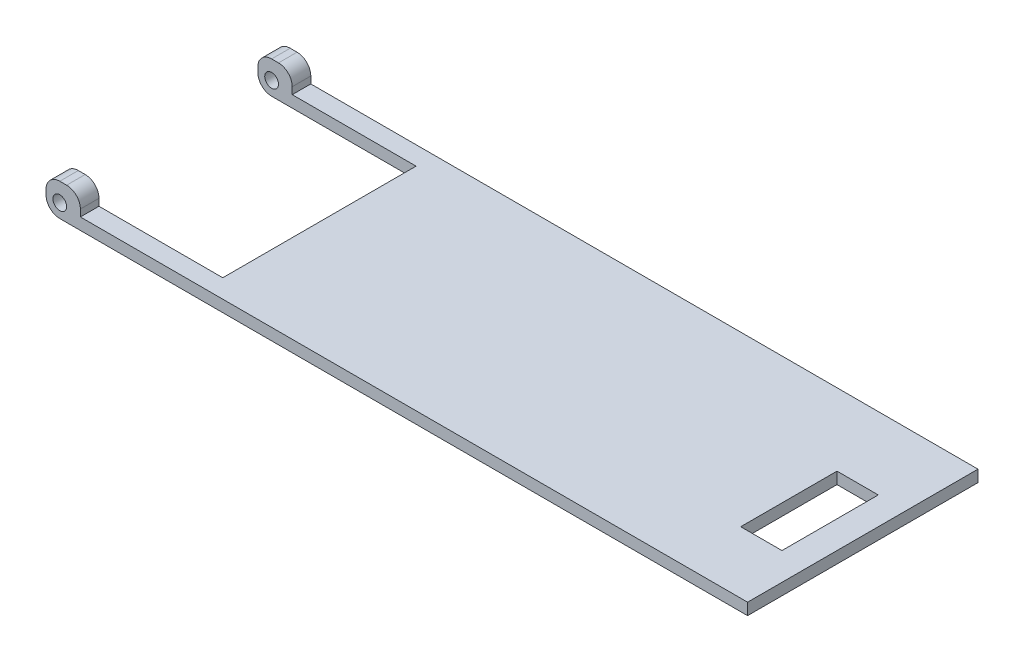
ISO-10303-21;
HEADER;
FILE_DESCRIPTION(('STEP AP214'),'2;1');
FILE_NAME('part.step','',(''),(''),'','','');
FILE_SCHEMA(('AUTOMOTIVE_DESIGN { 1 0 10303 214 1 1 1 1 }'));
ENDSEC;
DATA;
#1=APPLICATION_CONTEXT('core data for automotive mechanical design processes');
#2=APPLICATION_PROTOCOL_DEFINITION('international standard','automotive_design',2000,#1);
#3=PRODUCT_CONTEXT('',#1,'mechanical');
#4=PRODUCT('Part','Part','',(#3));
#5=PRODUCT_RELATED_PRODUCT_CATEGORY('part','',(#4));
#6=PRODUCT_DEFINITION_FORMATION('','',#4);
#7=PRODUCT_DEFINITION_CONTEXT('part definition',#1,'design');
#8=PRODUCT_DEFINITION('design','',#6,#7);
#9=PRODUCT_DEFINITION_SHAPE('','',#8);
#10=(LENGTH_UNIT() NAMED_UNIT(*) SI_UNIT(.MILLI.,.METRE.));
#11=(NAMED_UNIT(*) PLANE_ANGLE_UNIT() SI_UNIT($,.RADIAN.));
#12=(NAMED_UNIT(*) SI_UNIT($,.STERADIAN.) SOLID_ANGLE_UNIT());
#13=UNCERTAINTY_MEASURE_WITH_UNIT(LENGTH_MEASURE(1.E-05),#10,'distance_accuracy_value','');
#14=(GEOMETRIC_REPRESENTATION_CONTEXT(3) GLOBAL_UNCERTAINTY_ASSIGNED_CONTEXT((#13)) GLOBAL_UNIT_ASSIGNED_CONTEXT((#10,
#11,#12)) REPRESENTATION_CONTEXT('',''));
#15=CARTESIAN_POINT('',(0.,0.,0.));
#16=DIRECTION('',(0.,0.,1.));
#17=DIRECTION('',(1.,0.,0.));
#18=AXIS2_PLACEMENT_3D('',#15,#16,#17);
#19=CARTESIAN_POINT('',(0.,1.7,0.));
#20=DIRECTION('',(0.,-1.,0.));
#21=DIRECTION('',(0.,0.,-1.));
#22=AXIS2_PLACEMENT_3D('',#19,#20,#21);
#23=PLANE('',#22);
#24=DIRECTION('',(-1.,0.,0.));
#25=VECTOR('',#24,1.);
#26=CARTESIAN_POINT('',(41.,1.7,-6.25));
#27=LINE('',#26,#25);
#28=CARTESIAN_POINT('',(47.,1.7,-6.25));
#29=VERTEX_POINT('',#28);
#30=CARTESIAN_POINT('',(41.,1.7,-6.25));
#31=VERTEX_POINT('',#30);
#32=EDGE_CURVE('E228',#29,#31,#27,.T.);
#33=ORIENTED_EDGE('',*,*,#32,.F.);
#34=DIRECTION('',(0.,0.,-1.));
#35=VECTOR('',#34,1.);
#36=CARTESIAN_POINT('',(47.,1.7,7.75));
#37=LINE('',#36,#35);
#38=CARTESIAN_POINT('',(47.,1.7,7.75));
#39=VERTEX_POINT('',#38);
#40=EDGE_CURVE('E61',#39,#29,#37,.T.);
#41=ORIENTED_EDGE('',*,*,#40,.F.);
#42=DIRECTION('',(1.,0.,0.));
#43=VECTOR('',#42,1.);
#44=CARTESIAN_POINT('',(41.,1.7,7.75));
#45=LINE('',#44,#43);
#46=CARTESIAN_POINT('',(41.,1.7,7.75));
#47=VERTEX_POINT('',#46);
#48=EDGE_CURVE('E215',#47,#39,#45,.T.);
#49=ORIENTED_EDGE('',*,*,#48,.F.);
#50=DIRECTION('',(0.,0.,1.));
#51=VECTOR('',#50,1.);
#52=CARTESIAN_POINT('',(41.,1.7,7.75));
#53=LINE('',#52,#51);
#54=EDGE_CURVE('E219',#31,#47,#53,.T.);
#55=ORIENTED_EDGE('',*,*,#54,.F.);
#56=EDGE_LOOP('',(#33,#41,#49,#55));
#57=FACE_BOUND('',#56,.T.);
#58=DIRECTION('',(-1.,0.,0.));
#59=VECTOR('',#58,1.);
#60=CARTESIAN_POINT('',(-51.,1.7,-16.75));
#61=LINE('',#60,#59);
#62=CARTESIAN_POINT('',(51.,1.7,-16.75));
#63=VERTEX_POINT('',#62);
#64=CARTESIAN_POINT('',(-46.,1.7,-16.75));
#65=VERTEX_POINT('',#64);
#66=EDGE_CURVE('E336',#63,#65,#61,.T.);
#67=ORIENTED_EDGE('',*,*,#66,.T.);
#68=DIRECTION('',(0.,0.,1.));
#69=VECTOR('',#68,1.);
#70=CARTESIAN_POINT('',(-46.,1.7,-14.05));
#71=LINE('',#70,#69);
#72=CARTESIAN_POINT('',(-46.,1.7,-14.05));
#73=VERTEX_POINT('',#72);
#74=EDGE_CURVE('E247',#65,#73,#71,.T.);
#75=ORIENTED_EDGE('',*,*,#74,.T.);
#76=DIRECTION('',(-1.,0.,0.));
#77=VECTOR('',#76,1.);
#78=CARTESIAN_POINT('',(-51.,1.7,-14.05));
#79=LINE('',#78,#77);
#80=CARTESIAN_POINT('',(-28.,1.7,-14.05));
#81=VERTEX_POINT('',#80);
#82=EDGE_CURVE('E299',#81,#73,#79,.T.);
#83=ORIENTED_EDGE('',*,*,#82,.F.);
#84=DIRECTION('',(0.,0.,-1.));
#85=VECTOR('',#84,1.);
#86=CARTESIAN_POINT('',(-28.,1.7,14.05));
#87=LINE('',#86,#85);
#88=CARTESIAN_POINT('',(-28.,1.7,14.05));
#89=VERTEX_POINT('',#88);
#90=EDGE_CURVE('E310',#89,#81,#87,.T.);
#91=ORIENTED_EDGE('',*,*,#90,.F.);
#92=DIRECTION('',(1.,0.,0.));
#93=VECTOR('',#92,1.);
#94=CARTESIAN_POINT('',(-51.,1.7,14.05));
#95=LINE('',#94,#93);
#96=CARTESIAN_POINT('',(-46.,1.7,14.05));
#97=VERTEX_POINT('',#96);
#98=EDGE_CURVE('E294',#97,#89,#95,.T.);
#99=ORIENTED_EDGE('',*,*,#98,.F.);
#100=DIRECTION('',(0.,0.,-1.));
#101=VECTOR('',#100,1.);
#102=CARTESIAN_POINT('',(-46.,1.7,14.05));
#103=LINE('',#102,#101);
#104=CARTESIAN_POINT('',(-46.,1.7,16.75));
#105=VERTEX_POINT('',#104);
#106=EDGE_CURVE('E273',#105,#97,#103,.T.);
#107=ORIENTED_EDGE('',*,*,#106,.F.);
#108=DIRECTION('',(1.,0.,0.));
#109=VECTOR('',#108,1.);
#110=CARTESIAN_POINT('',(-51.,1.7,16.75));
#111=LINE('',#110,#109);
#112=CARTESIAN_POINT('',(51.,1.7,16.75));
#113=VERTEX_POINT('',#112);
#114=EDGE_CURVE('E341',#105,#113,#111,.T.);
#115=ORIENTED_EDGE('',*,*,#114,.T.);
#116=DIRECTION('',(0.,0.,-1.));
#117=VECTOR('',#116,1.);
#118=CARTESIAN_POINT('',(51.,1.7,16.75));
#119=LINE('',#118,#117);
#120=EDGE_CURVE('E332',#113,#63,#119,.T.);
#121=ORIENTED_EDGE('',*,*,#120,.T.);
#122=EDGE_LOOP('',(#67,#75,#83,#91,#99,#107,#115,#121));
#123=FACE_BOUND('',#122,.T.);
#124=ADVANCED_FACE('F45',(#57,#123),#23,.F.);
#125=CARTESIAN_POINT('',(-51.,1.7,16.75));
#126=DIRECTION('',(1.,0.,0.));
#127=DIRECTION('',(0.,0.,-1.));
#128=AXIS2_PLACEMENT_3D('',#125,#126,#127);
#129=PLANE('',#128);
#130=DIRECTION('',(0.,-1.,0.));
#131=VECTOR('',#130,1.);
#132=CARTESIAN_POINT('',(-51.,1.7,-16.75));
#133=LINE('',#132,#131);
#134=CARTESIAN_POINT('',(-51.,2.7,-16.75));
#135=VERTEX_POINT('',#134);
#136=CARTESIAN_POINT('',(-51.,2.,-16.75));
#137=VERTEX_POINT('',#136);
#138=EDGE_CURVE('E361',#135,#137,#133,.T.);
#139=ORIENTED_EDGE('',*,*,#138,.T.);
#140=DIRECTION('',(0.,0.,1.));
#141=VECTOR('',#140,1.);
#142=CARTESIAN_POINT('',(-51.,2.,-14.05));
#143=LINE('',#142,#141);
#144=CARTESIAN_POINT('',(-51.,2.,-14.05));
#145=VERTEX_POINT('',#144);
#146=EDGE_CURVE('E412',#137,#145,#143,.T.);
#147=ORIENTED_EDGE('',*,*,#146,.T.);
#148=DIRECTION('',(0.,1.,0.));
#149=VECTOR('',#148,1.);
#150=CARTESIAN_POINT('',(-51.,0.,-14.05));
#151=LINE('',#150,#149);
#152=CARTESIAN_POINT('',(-51.,2.7,-14.05));
#153=VERTEX_POINT('',#152);
#154=EDGE_CURVE('E317',#145,#153,#151,.T.);
#155=ORIENTED_EDGE('',*,*,#154,.T.);
#156=DIRECTION('',(0.,0.,-1.));
#157=VECTOR('',#156,1.);
#158=CARTESIAN_POINT('',(-51.,2.7,-16.75));
#159=LINE('',#158,#157);
#160=EDGE_CURVE('E408',#153,#135,#159,.T.);
#161=ORIENTED_EDGE('',*,*,#160,.T.);
#162=EDGE_LOOP('',(#139,#147,#155,#161));
#163=FACE_BOUND('',#162,.T.);
#164=ADVANCED_FACE('F456',(#163),#129,.F.);
#165=CARTESIAN_POINT('',(51.,1.7,16.75));
#166=DIRECTION('',(-1.,0.,0.));
#167=DIRECTION('',(0.,0.,1.));
#168=AXIS2_PLACEMENT_3D('',#165,#166,#167);
#169=PLANE('',#168);
#170=DIRECTION('',(0.,0.,-1.));
#171=VECTOR('',#170,1.);
#172=CARTESIAN_POINT('',(51.,0.,16.75));
#173=LINE('',#172,#171);
#174=CARTESIAN_POINT('',(51.,0.,16.75));
#175=VERTEX_POINT('',#174);
#176=CARTESIAN_POINT('',(51.,0.,-16.75));
#177=VERTEX_POINT('',#176);
#178=EDGE_CURVE('E321',#175,#177,#173,.T.);
#179=ORIENTED_EDGE('',*,*,#178,.T.);
#180=DIRECTION('',(0.,-1.,0.));
#181=VECTOR('',#180,1.);
#182=CARTESIAN_POINT('',(51.,1.7,-16.75));
#183=LINE('',#182,#181);
#184=EDGE_CURVE('E365',#63,#177,#183,.T.);
#185=ORIENTED_EDGE('',*,*,#184,.F.);
#186=ORIENTED_EDGE('',*,*,#120,.F.);
#187=DIRECTION('',(0.,-1.,0.));
#188=VECTOR('',#187,1.);
#189=CARTESIAN_POINT('',(51.,1.7,16.75));
#190=LINE('',#189,#188);
#191=EDGE_CURVE('E344',#113,#175,#190,.T.);
#192=ORIENTED_EDGE('',*,*,#191,.T.);
#193=EDGE_LOOP('',(#179,#185,#186,#192));
#194=FACE_BOUND('',#193,.T.);
#195=ADVANCED_FACE('F512',(#194),#169,.F.);
#196=CARTESIAN_POINT('',(-51.,1.7,-16.75));
#197=DIRECTION('',(0.,0.,1.));
#198=DIRECTION('',(1.,0.,0.));
#199=AXIS2_PLACEMENT_3D('',#196,#197,#198);
#200=PLANE('',#199);
#201=CARTESIAN_POINT('',(-49.,2.,-16.75));
#202=DIRECTION('',(0.,0.,1.));
#203=DIRECTION('',(1.,0.,0.));
#204=AXIS2_PLACEMENT_3D('',#201,#202,#203);
#205=CIRCLE('',#204,0.999999999999998);
#206=CARTESIAN_POINT('',(-50.,2.,-16.75));
#207=VERTEX_POINT('',#206);
#208=EDGE_CURVE('E237',#207,#207,#205,.T.);
#209=ORIENTED_EDGE('',*,*,#208,.T.);
#210=EDGE_LOOP('',(#209));
#211=FACE_BOUND('',#210,.T.);
#212=DIRECTION('',(-1.,0.,0.));
#213=VECTOR('',#212,1.);
#214=CARTESIAN_POINT('',(-51.,0.,-16.75));
#215=LINE('',#214,#213);
#216=CARTESIAN_POINT('',(-49.,0.,-16.75));
#217=VERTEX_POINT('',#216);
#218=EDGE_CURVE('E348',#177,#217,#215,.T.);
#219=ORIENTED_EDGE('',*,*,#218,.T.);
#220=CARTESIAN_POINT('',(-49.,2.,-16.75));
#221=DIRECTION('',(0.,0.,1.));
#222=DIRECTION('',(1.,0.,0.));
#223=AXIS2_PLACEMENT_3D('',#220,#221,#222);
#224=CIRCLE('',#223,2.);
#225=EDGE_CURVE('E434',#217,#137,#224,.F.);
#226=ORIENTED_EDGE('',*,*,#225,.T.);
#227=ORIENTED_EDGE('',*,*,#138,.F.);
#228=CARTESIAN_POINT('',(-49.,2.7,-16.75));
#229=DIRECTION('',(0.,0.,1.));
#230=DIRECTION('',(1.,0.,0.));
#231=AXIS2_PLACEMENT_3D('',#228,#229,#230);
#232=CIRCLE('',#231,2.);
#233=CARTESIAN_POINT('',(-49.,4.7,-16.75));
#234=VERTEX_POINT('',#233);
#235=EDGE_CURVE('E428',#135,#234,#232,.F.);
#236=ORIENTED_EDGE('',*,*,#235,.T.);
#237=DIRECTION('',(1.,0.,0.));
#238=VECTOR('',#237,1.);
#239=CARTESIAN_POINT('',(-51.,4.7,-16.75));
#240=LINE('',#239,#238);
#241=CARTESIAN_POINT('',(-48.,4.7,-16.75));
#242=VERTEX_POINT('',#241);
#243=EDGE_CURVE('E255',#234,#242,#240,.T.);
#244=ORIENTED_EDGE('',*,*,#243,.T.);
#245=CARTESIAN_POINT('',(-48.,2.7,-16.75));
#246=DIRECTION('',(0.,0.,1.));
#247=DIRECTION('',(1.,0.,0.));
#248=AXIS2_PLACEMENT_3D('',#245,#246,#247);
#249=CIRCLE('',#248,2.);
#250=CARTESIAN_POINT('',(-46.,2.7,-16.75));
#251=VERTEX_POINT('',#250);
#252=EDGE_CURVE('E431',#242,#251,#249,.F.);
#253=ORIENTED_EDGE('',*,*,#252,.T.);
#254=DIRECTION('',(0.,-1.,0.));
#255=VECTOR('',#254,1.);
#256=CARTESIAN_POINT('',(-46.,4.7,-16.75));
#257=LINE('',#256,#255);
#258=EDGE_CURVE('E259',#251,#65,#257,.T.);
#259=ORIENTED_EDGE('',*,*,#258,.T.);
#260=ORIENTED_EDGE('',*,*,#66,.F.);
#261=ORIENTED_EDGE('',*,*,#184,.T.);
#262=EDGE_LOOP('',(#219,#226,#227,#236,#244,#253,#259,#260,#261));
#263=FACE_BOUND('',#262,.T.);
#264=ADVANCED_FACE('F459',(#211,#263),#200,.F.);
#265=DIRECTION('',(0.,1.,0.));
#266=VECTOR('',#265,1.);
#267=CARTESIAN_POINT('',(-51.,0.,14.05));
#268=LINE('',#267,#266);
#269=CARTESIAN_POINT('',(-51.,2.,14.05));
#270=VERTEX_POINT('',#269);
#271=CARTESIAN_POINT('',(-51.,2.7,14.05));
#272=VERTEX_POINT('',#271);
#273=EDGE_CURVE('E307',#270,#272,#268,.T.);
#274=ORIENTED_EDGE('',*,*,#273,.F.);
#275=DIRECTION('',(0.,0.,1.));
#276=VECTOR('',#275,1.);
#277=CARTESIAN_POINT('',(-51.,2.,16.75));
#278=LINE('',#277,#276);
#279=CARTESIAN_POINT('',(-51.,2.,16.75));
#280=VERTEX_POINT('',#279);
#281=EDGE_CURVE('E372',#270,#280,#278,.T.);
#282=ORIENTED_EDGE('',*,*,#281,.T.);
#283=DIRECTION('',(0.,-1.,0.));
#284=VECTOR('',#283,1.);
#285=CARTESIAN_POINT('',(-51.,1.7,16.75));
#286=LINE('',#285,#284);
#287=CARTESIAN_POINT('',(-51.,2.7,16.75));
#288=VERTEX_POINT('',#287);
#289=EDGE_CURVE('E357',#288,#280,#286,.T.);
#290=ORIENTED_EDGE('',*,*,#289,.F.);
#291=DIRECTION('',(0.,0.,1.));
#292=VECTOR('',#291,1.);
#293=CARTESIAN_POINT('',(-51.,2.7,14.05));
#294=LINE('',#293,#292);
#295=EDGE_CURVE('E369',#288,#272,#294,.F.);
#296=ORIENTED_EDGE('',*,*,#295,.T.);
#297=EDGE_LOOP('',(#274,#282,#290,#296));
#298=FACE_BOUND('',#297,.T.);
#299=ADVANCED_FACE('F503',(#298),#129,.F.);
#300=CARTESIAN_POINT('',(-51.,1.7,16.75));
#301=DIRECTION('',(0.,0.,-1.));
#302=DIRECTION('',(-1.,0.,0.));
#303=AXIS2_PLACEMENT_3D('',#300,#301,#302);
#304=PLANE('',#303);
#305=CARTESIAN_POINT('',(-49.,2.,16.75));
#306=DIRECTION('',(0.,0.,1.));
#307=DIRECTION('',(1.,0.,0.));
#308=AXIS2_PLACEMENT_3D('',#305,#306,#307);
#309=CIRCLE('',#308,0.999999999999998);
#310=CARTESIAN_POINT('',(-48.,2.,16.75));
#311=VERTEX_POINT('',#310);
#312=EDGE_CURVE('E268',#311,#311,#309,.T.);
#313=ORIENTED_EDGE('',*,*,#312,.F.);
#314=EDGE_LOOP('',(#313));
#315=FACE_BOUND('',#314,.T.);
#316=ORIENTED_EDGE('',*,*,#289,.T.);
#317=CARTESIAN_POINT('',(-49.,2.,16.75));
#318=DIRECTION('',(0.,0.,-1.));
#319=DIRECTION('',(-1.,0.,0.));
#320=AXIS2_PLACEMENT_3D('',#317,#318,#319);
#321=CIRCLE('',#320,2.);
#322=CARTESIAN_POINT('',(-49.,0.,16.75));
#323=VERTEX_POINT('',#322);
#324=EDGE_CURVE('E382',#280,#323,#321,.F.);
#325=ORIENTED_EDGE('',*,*,#324,.T.);
#326=DIRECTION('',(1.,0.,0.));
#327=VECTOR('',#326,1.);
#328=CARTESIAN_POINT('',(-51.,0.,16.75));
#329=LINE('',#328,#327);
#330=EDGE_CURVE('E337',#323,#175,#329,.T.);
#331=ORIENTED_EDGE('',*,*,#330,.T.);
#332=ORIENTED_EDGE('',*,*,#191,.F.);
#333=ORIENTED_EDGE('',*,*,#114,.F.);
#334=DIRECTION('',(0.,-1.,0.));
#335=VECTOR('',#334,1.);
#336=CARTESIAN_POINT('',(-46.,4.7,16.75));
#337=LINE('',#336,#335);
#338=CARTESIAN_POINT('',(-46.,2.7,16.75));
#339=VERTEX_POINT('',#338);
#340=EDGE_CURVE('E291',#339,#105,#337,.T.);
#341=ORIENTED_EDGE('',*,*,#340,.F.);
#342=CARTESIAN_POINT('',(-48.,2.7,16.75));
#343=DIRECTION('',(0.,0.,-1.));
#344=DIRECTION('',(-1.,0.,0.));
#345=AXIS2_PLACEMENT_3D('',#342,#343,#344);
#346=CIRCLE('',#345,2.);
#347=CARTESIAN_POINT('',(-48.,4.7,16.75));
#348=VERTEX_POINT('',#347);
#349=EDGE_CURVE('E379',#339,#348,#346,.F.);
#350=ORIENTED_EDGE('',*,*,#349,.T.);
#351=DIRECTION('',(1.,0.,0.));
#352=VECTOR('',#351,1.);
#353=CARTESIAN_POINT('',(-51.,4.7,16.75));
#354=LINE('',#353,#352);
#355=CARTESIAN_POINT('',(-49.,4.7,16.75));
#356=VERTEX_POINT('',#355);
#357=EDGE_CURVE('E277',#356,#348,#354,.T.);
#358=ORIENTED_EDGE('',*,*,#357,.F.);
#359=CARTESIAN_POINT('',(-49.,2.7,16.75));
#360=DIRECTION('',(0.,0.,-1.));
#361=DIRECTION('',(-1.,0.,0.));
#362=AXIS2_PLACEMENT_3D('',#359,#360,#361);
#363=CIRCLE('',#362,2.);
#364=EDGE_CURVE('E376',#356,#288,#363,.F.);
#365=ORIENTED_EDGE('',*,*,#364,.T.);
#366=EDGE_LOOP('',(#316,#325,#331,#332,#333,#341,#350,#358,#365));
#367=FACE_BOUND('',#366,.T.);
#368=ADVANCED_FACE('F486',(#315,#367),#304,.F.);
#369=CARTESIAN_POINT('',(0.,0.,0.));
#370=DIRECTION('',(0.,-1.,0.));
#371=DIRECTION('',(0.,0.,-1.));
#372=AXIS2_PLACEMENT_3D('',#369,#370,#371);
#373=PLANE('',#372);
#374=DIRECTION('',(0.,0.,-1.));
#375=VECTOR('',#374,1.);
#376=CARTESIAN_POINT('',(47.,0.,7.75));
#377=LINE('',#376,#375);
#378=CARTESIAN_POINT('',(47.,0.,7.75));
#379=VERTEX_POINT('',#378);
#380=CARTESIAN_POINT('',(47.,0.,-6.25));
#381=VERTEX_POINT('',#380);
#382=EDGE_CURVE('E196',#379,#381,#377,.T.);
#383=ORIENTED_EDGE('',*,*,#382,.T.);
#384=DIRECTION('',(-1.,0.,0.));
#385=VECTOR('',#384,1.);
#386=CARTESIAN_POINT('',(41.,0.,-6.25));
#387=LINE('',#386,#385);
#388=CARTESIAN_POINT('',(41.,0.,-6.25));
#389=VERTEX_POINT('',#388);
#390=EDGE_CURVE('E206',#381,#389,#387,.T.);
#391=ORIENTED_EDGE('',*,*,#390,.T.);
#392=DIRECTION('',(0.,0.,1.));
#393=VECTOR('',#392,1.);
#394=CARTESIAN_POINT('',(41.,0.,7.75));
#395=LINE('',#394,#393);
#396=CARTESIAN_POINT('',(41.,0.,7.75));
#397=VERTEX_POINT('',#396);
#398=EDGE_CURVE('E69',#389,#397,#395,.T.);
#399=ORIENTED_EDGE('',*,*,#398,.T.);
#400=DIRECTION('',(1.,0.,0.));
#401=VECTOR('',#400,1.);
#402=CARTESIAN_POINT('',(41.,0.,7.75));
#403=LINE('',#402,#401);
#404=EDGE_CURVE('E203',#397,#379,#403,.T.);
#405=ORIENTED_EDGE('',*,*,#404,.T.);
#406=EDGE_LOOP('',(#383,#391,#399,#405));
#407=FACE_BOUND('',#406,.T.);
#408=DIRECTION('',(-1.,0.,0.));
#409=VECTOR('',#408,1.);
#410=CARTESIAN_POINT('',(-51.,0.,-14.05));
#411=LINE('',#410,#409);
#412=CARTESIAN_POINT('',(-28.,0.,-14.05));
#413=VERTEX_POINT('',#412);
#414=CARTESIAN_POINT('',(-49.,0.,-14.05));
#415=VERTEX_POINT('',#414);
#416=EDGE_CURVE('E303',#413,#415,#411,.T.);
#417=ORIENTED_EDGE('',*,*,#416,.T.);
#418=DIRECTION('',(0.,0.,1.));
#419=VECTOR('',#418,1.);
#420=CARTESIAN_POINT('',(-49.,0.,-16.75));
#421=LINE('',#420,#419);
#422=EDGE_CURVE('E425',#415,#217,#421,.F.);
#423=ORIENTED_EDGE('',*,*,#422,.T.);
#424=ORIENTED_EDGE('',*,*,#218,.F.);
#425=ORIENTED_EDGE('',*,*,#178,.F.);
#426=ORIENTED_EDGE('',*,*,#330,.F.);
#427=DIRECTION('',(0.,0.,1.));
#428=VECTOR('',#427,1.);
#429=CARTESIAN_POINT('',(-49.,0.,14.05));
#430=LINE('',#429,#428);
#431=CARTESIAN_POINT('',(-49.,0.,14.05));
#432=VERTEX_POINT('',#431);
#433=EDGE_CURVE('E385',#323,#432,#430,.F.);
#434=ORIENTED_EDGE('',*,*,#433,.T.);
#435=DIRECTION('',(1.,0.,0.));
#436=VECTOR('',#435,1.);
#437=CARTESIAN_POINT('',(-51.,0.,14.05));
#438=LINE('',#437,#436);
#439=CARTESIAN_POINT('',(-28.,0.,14.05));
#440=VERTEX_POINT('',#439);
#441=EDGE_CURVE('E295',#432,#440,#438,.T.);
#442=ORIENTED_EDGE('',*,*,#441,.T.);
#443=DIRECTION('',(0.,0.,-1.));
#444=VECTOR('',#443,1.);
#445=CARTESIAN_POINT('',(-28.,0.,14.05));
#446=LINE('',#445,#444);
#447=EDGE_CURVE('E298',#440,#413,#446,.T.);
#448=ORIENTED_EDGE('',*,*,#447,.T.);
#449=EDGE_LOOP('',(#417,#423,#424,#425,#426,#434,#442,#448));
#450=FACE_BOUND('',#449,.T.);
#451=ADVANCED_FACE('F211',(#407,#450),#373,.T.);
#452=CARTESIAN_POINT('',(-51.,0.,-14.05));
#453=DIRECTION('',(0.,0.,-1.));
#454=DIRECTION('',(-1.,0.,0.));
#455=AXIS2_PLACEMENT_3D('',#452,#453,#454);
#456=PLANE('',#455);
#457=CARTESIAN_POINT('',(-49.,2.,-14.05));
#458=DIRECTION('',(0.,0.,1.));
#459=DIRECTION('',(1.,0.,0.));
#460=AXIS2_PLACEMENT_3D('',#457,#458,#459);
#461=CIRCLE('',#460,0.999999999999998);
#462=CARTESIAN_POINT('',(-50.,2.,-14.05));
#463=VERTEX_POINT('',#462);
#464=EDGE_CURVE('E243',#463,#463,#461,.T.);
#465=ORIENTED_EDGE('',*,*,#464,.F.);
#466=EDGE_LOOP('',(#465));
#467=FACE_BOUND('',#466,.T.);
#468=ORIENTED_EDGE('',*,*,#154,.F.);
#469=CARTESIAN_POINT('',(-49.,2.,-14.05));
#470=DIRECTION('',(0.,0.,-1.));
#471=DIRECTION('',(-1.,0.,0.));
#472=AXIS2_PLACEMENT_3D('',#469,#470,#471);
#473=CIRCLE('',#472,2.);
#474=EDGE_CURVE('E422',#145,#415,#473,.F.);
#475=ORIENTED_EDGE('',*,*,#474,.T.);
#476=ORIENTED_EDGE('',*,*,#416,.F.);
#477=DIRECTION('',(0.,1.,0.));
#478=VECTOR('',#477,1.);
#479=CARTESIAN_POINT('',(-28.,0.,-14.05));
#480=LINE('',#479,#478);
#481=EDGE_CURVE('E322',#413,#81,#480,.T.);
#482=ORIENTED_EDGE('',*,*,#481,.T.);
#483=ORIENTED_EDGE('',*,*,#82,.T.);
#484=DIRECTION('',(0.,-1.,0.));
#485=VECTOR('',#484,1.);
#486=CARTESIAN_POINT('',(-46.,4.7,-14.05));
#487=LINE('',#486,#485);
#488=CARTESIAN_POINT('',(-46.,2.7,-14.05));
#489=VERTEX_POINT('',#488);
#490=EDGE_CURVE('E265',#489,#73,#487,.T.);
#491=ORIENTED_EDGE('',*,*,#490,.F.);
#492=CARTESIAN_POINT('',(-48.,2.7,-14.05));
#493=DIRECTION('',(0.,0.,-1.));
#494=DIRECTION('',(-1.,0.,0.));
#495=AXIS2_PLACEMENT_3D('',#492,#493,#494);
#496=CIRCLE('',#495,2.);
#497=CARTESIAN_POINT('',(-48.,4.7,-14.05));
#498=VERTEX_POINT('',#497);
#499=EDGE_CURVE('E419',#489,#498,#496,.F.);
#500=ORIENTED_EDGE('',*,*,#499,.T.);
#501=DIRECTION('',(-1.,0.,0.));
#502=VECTOR('',#501,1.);
#503=CARTESIAN_POINT('',(-51.,4.7,-14.05));
#504=LINE('',#503,#502);
#505=CARTESIAN_POINT('',(-49.,4.7,-14.05));
#506=VERTEX_POINT('',#505);
#507=EDGE_CURVE('E251',#498,#506,#504,.T.);
#508=ORIENTED_EDGE('',*,*,#507,.T.);
#509=CARTESIAN_POINT('',(-49.,2.7,-14.05));
#510=DIRECTION('',(0.,0.,-1.));
#511=DIRECTION('',(-1.,0.,0.));
#512=AXIS2_PLACEMENT_3D('',#509,#510,#511);
#513=CIRCLE('',#512,2.);
#514=EDGE_CURVE('E416',#506,#153,#513,.F.);
#515=ORIENTED_EDGE('',*,*,#514,.T.);
#516=EDGE_LOOP('',(#468,#475,#476,#482,#483,#491,#500,#508,#515));
#517=FACE_BOUND('',#516,.T.);
#518=ADVANCED_FACE('F451',(#467,#517),#456,.F.);
#519=CARTESIAN_POINT('',(-28.,0.,14.05));
#520=DIRECTION('',(1.,0.,0.));
#521=DIRECTION('',(0.,0.,-1.));
#522=AXIS2_PLACEMENT_3D('',#519,#520,#521);
#523=PLANE('',#522);
#524=ORIENTED_EDGE('',*,*,#90,.T.);
#525=ORIENTED_EDGE('',*,*,#481,.F.);
#526=ORIENTED_EDGE('',*,*,#447,.F.);
#527=DIRECTION('',(0.,1.,0.));
#528=VECTOR('',#527,1.);
#529=CARTESIAN_POINT('',(-28.,0.,14.05));
#530=LINE('',#529,#528);
#531=EDGE_CURVE('E325',#440,#89,#530,.T.);
#532=ORIENTED_EDGE('',*,*,#531,.T.);
#533=EDGE_LOOP('',(#524,#525,#526,#532));
#534=FACE_BOUND('',#533,.T.);
#535=ADVANCED_FACE('F469',(#534),#523,.F.);
#536=CARTESIAN_POINT('',(-51.,0.,14.05));
#537=DIRECTION('',(0.,0.,1.));
#538=DIRECTION('',(1.,0.,0.));
#539=AXIS2_PLACEMENT_3D('',#536,#537,#538);
#540=PLANE('',#539);
#541=CARTESIAN_POINT('',(-49.,2.,14.05));
#542=DIRECTION('',(0.,0.,1.));
#543=DIRECTION('',(1.,0.,0.));
#544=AXIS2_PLACEMENT_3D('',#541,#542,#543);
#545=CIRCLE('',#544,0.999999999999998);
#546=CARTESIAN_POINT('',(-48.,2.,14.05));
#547=VERTEX_POINT('',#546);
#548=EDGE_CURVE('E269',#547,#547,#545,.T.);
#549=ORIENTED_EDGE('',*,*,#548,.T.);
#550=EDGE_LOOP('',(#549));
#551=FACE_BOUND('',#550,.T.);
#552=ORIENTED_EDGE('',*,*,#441,.F.);
#553=CARTESIAN_POINT('',(-49.,2.,14.05));
#554=DIRECTION('',(0.,0.,1.));
#555=DIRECTION('',(1.,0.,0.));
#556=AXIS2_PLACEMENT_3D('',#553,#554,#555);
#557=CIRCLE('',#556,2.);
#558=EDGE_CURVE('E394',#432,#270,#557,.F.);
#559=ORIENTED_EDGE('',*,*,#558,.T.);
#560=ORIENTED_EDGE('',*,*,#273,.T.);
#561=CARTESIAN_POINT('',(-49.,2.7,14.05));
#562=DIRECTION('',(0.,0.,1.));
#563=DIRECTION('',(1.,0.,0.));
#564=AXIS2_PLACEMENT_3D('',#561,#562,#563);
#565=CIRCLE('',#564,2.);
#566=CARTESIAN_POINT('',(-49.,4.7,14.05));
#567=VERTEX_POINT('',#566);
#568=EDGE_CURVE('E388',#272,#567,#565,.F.);
#569=ORIENTED_EDGE('',*,*,#568,.T.);
#570=DIRECTION('',(-1.,0.,0.));
#571=VECTOR('',#570,1.);
#572=CARTESIAN_POINT('',(-51.,4.7,14.05));
#573=LINE('',#572,#571);
#574=CARTESIAN_POINT('',(-48.,4.7,14.05));
#575=VERTEX_POINT('',#574);
#576=EDGE_CURVE('E281',#575,#567,#573,.T.);
#577=ORIENTED_EDGE('',*,*,#576,.F.);
#578=CARTESIAN_POINT('',(-48.,2.7,14.05));
#579=DIRECTION('',(0.,0.,1.));
#580=DIRECTION('',(1.,0.,0.));
#581=AXIS2_PLACEMENT_3D('',#578,#579,#580);
#582=CIRCLE('',#581,2.);
#583=CARTESIAN_POINT('',(-46.,2.7,14.05));
#584=VERTEX_POINT('',#583);
#585=EDGE_CURVE('E391',#575,#584,#582,.F.);
#586=ORIENTED_EDGE('',*,*,#585,.T.);
#587=DIRECTION('',(0.,-1.,0.));
#588=VECTOR('',#587,1.);
#589=CARTESIAN_POINT('',(-46.,4.7,14.05));
#590=LINE('',#589,#588);
#591=EDGE_CURVE('E285',#584,#97,#590,.T.);
#592=ORIENTED_EDGE('',*,*,#591,.T.);
#593=ORIENTED_EDGE('',*,*,#98,.T.);
#594=ORIENTED_EDGE('',*,*,#531,.F.);
#595=EDGE_LOOP('',(#552,#559,#560,#569,#577,#586,#592,#593,#594));
#596=FACE_BOUND('',#595,.T.);
#597=ADVANCED_FACE('F472',(#551,#596),#540,.F.);
#598=CARTESIAN_POINT('',(-46.,4.7,14.05));
#599=DIRECTION('',(-1.,0.,0.));
#600=DIRECTION('',(0.,0.,1.));
#601=AXIS2_PLACEMENT_3D('',#598,#599,#600);
#602=PLANE('',#601);
#603=ORIENTED_EDGE('',*,*,#591,.F.);
#604=DIRECTION('',(0.,0.,-1.));
#605=VECTOR('',#604,1.);
#606=CARTESIAN_POINT('',(-46.,2.7,16.75));
#607=LINE('',#606,#605);
#608=EDGE_CURVE('E405',#584,#339,#607,.F.);
#609=ORIENTED_EDGE('',*,*,#608,.T.);
#610=ORIENTED_EDGE('',*,*,#340,.T.);
#611=ORIENTED_EDGE('',*,*,#106,.T.);
#612=EDGE_LOOP('',(#603,#609,#610,#611));
#613=FACE_BOUND('',#612,.T.);
#614=ADVANCED_FACE('F481',(#613),#602,.F.);
#615=CARTESIAN_POINT('',(0.,4.7,0.));
#616=DIRECTION('',(0.,1.,0.));
#617=DIRECTION('',(0.,0.,1.));
#618=AXIS2_PLACEMENT_3D('',#615,#616,#617);
#619=PLANE('',#618);
#620=ORIENTED_EDGE('',*,*,#357,.T.);
#621=DIRECTION('',(0.,0.,-1.));
#622=VECTOR('',#621,1.);
#623=CARTESIAN_POINT('',(-48.,4.7,14.05));
#624=LINE('',#623,#622);
#625=EDGE_CURVE('E401',#348,#575,#624,.T.);
#626=ORIENTED_EDGE('',*,*,#625,.T.);
#627=ORIENTED_EDGE('',*,*,#576,.T.);
#628=DIRECTION('',(0.,0.,1.));
#629=VECTOR('',#628,1.);
#630=CARTESIAN_POINT('',(-49.,4.7,16.75));
#631=LINE('',#630,#629);
#632=EDGE_CURVE('E397',#567,#356,#631,.T.);
#633=ORIENTED_EDGE('',*,*,#632,.T.);
#634=EDGE_LOOP('',(#620,#626,#627,#633));
#635=FACE_BOUND('',#634,.T.);
#636=ADVANCED_FACE('F494',(#635),#619,.T.);
#637=CARTESIAN_POINT('',(-49.,2.,14.05));
#638=DIRECTION('',(0.,0.,1.));
#639=DIRECTION('',(1.,0.,0.));
#640=AXIS2_PLACEMENT_3D('',#637,#638,#639);
#641=CYLINDRICAL_SURFACE('',#640,0.999999999999998);
#642=CARTESIAN_POINT('',(-48.,2.,14.05));
#643=CARTESIAN_POINT('',(-48.,2.,14.078125));
#644=CARTESIAN_POINT('',(-48.,2.,14.10625));
#645=CARTESIAN_POINT('',(-48.,2.,14.1625));
#646=CARTESIAN_POINT('',(-48.,2.,14.190625));
#647=CARTESIAN_POINT('',(-48.,2.,14.246875));
#648=CARTESIAN_POINT('',(-48.,2.,14.275));
#649=CARTESIAN_POINT('',(-48.,2.,14.33125));
#650=CARTESIAN_POINT('',(-48.,2.,14.359375));
#651=CARTESIAN_POINT('',(-48.,2.,14.415625));
#652=CARTESIAN_POINT('',(-48.,2.,14.44375));
#653=CARTESIAN_POINT('',(-48.,2.,14.5));
#654=CARTESIAN_POINT('',(-48.,2.,14.528125));
#655=CARTESIAN_POINT('',(-48.,2.,14.584375));
#656=CARTESIAN_POINT('',(-48.,2.,14.6125));
#657=CARTESIAN_POINT('',(-48.,2.,14.66875));
#658=CARTESIAN_POINT('',(-48.,2.,14.696875));
#659=CARTESIAN_POINT('',(-48.,2.,14.753125));
#660=CARTESIAN_POINT('',(-48.,2.,14.78125));
#661=CARTESIAN_POINT('',(-48.,2.,14.8375));
#662=CARTESIAN_POINT('',(-48.,2.,14.865625));
#663=CARTESIAN_POINT('',(-48.,2.,14.921875));
#664=CARTESIAN_POINT('',(-48.,2.,14.95));
#665=CARTESIAN_POINT('',(-48.,2.,15.00625));
#666=CARTESIAN_POINT('',(-48.,2.,15.034375));
#667=CARTESIAN_POINT('',(-48.,2.,15.090625));
#668=CARTESIAN_POINT('',(-48.,2.,15.11875));
#669=CARTESIAN_POINT('',(-48.,2.,15.175));
#670=CARTESIAN_POINT('',(-48.,2.,15.203125));
#671=CARTESIAN_POINT('',(-48.,2.,15.259375));
#672=CARTESIAN_POINT('',(-48.,2.,15.2875));
#673=CARTESIAN_POINT('',(-48.,2.,15.34375));
#674=CARTESIAN_POINT('',(-48.,2.,15.371875));
#675=CARTESIAN_POINT('',(-48.,2.,15.428125));
#676=CARTESIAN_POINT('',(-48.,2.,15.45625));
#677=CARTESIAN_POINT('',(-48.,2.,15.5125));
#678=CARTESIAN_POINT('',(-48.,2.,15.540625));
#679=CARTESIAN_POINT('',(-48.,2.,15.596875));
#680=CARTESIAN_POINT('',(-48.,2.,15.625));
#681=CARTESIAN_POINT('',(-48.,2.,15.68125));
#682=CARTESIAN_POINT('',(-48.,2.,15.709375));
#683=CARTESIAN_POINT('',(-48.,2.,15.765625));
#684=CARTESIAN_POINT('',(-48.,2.,15.79375));
#685=CARTESIAN_POINT('',(-48.,2.,15.85));
#686=CARTESIAN_POINT('',(-48.,2.,15.878125));
#687=CARTESIAN_POINT('',(-48.,2.,15.934375));
#688=CARTESIAN_POINT('',(-48.,2.,15.9625));
#689=CARTESIAN_POINT('',(-48.,2.,16.01875));
#690=CARTESIAN_POINT('',(-48.,2.,16.046875));
#691=CARTESIAN_POINT('',(-48.,2.,16.103125));
#692=CARTESIAN_POINT('',(-48.,2.,16.13125));
#693=CARTESIAN_POINT('',(-48.,2.,16.1875));
#694=CARTESIAN_POINT('',(-48.,2.,16.215625));
#695=CARTESIAN_POINT('',(-48.,2.,16.271875));
#696=CARTESIAN_POINT('',(-48.,2.,16.3));
#697=CARTESIAN_POINT('',(-48.,2.,16.35625));
#698=CARTESIAN_POINT('',(-48.,2.,16.384375));
#699=CARTESIAN_POINT('',(-48.,2.,16.440625));
#700=CARTESIAN_POINT('',(-48.,2.,16.46875));
#701=CARTESIAN_POINT('',(-48.,2.,16.525));
#702=CARTESIAN_POINT('',(-48.,2.,16.553125));
#703=CARTESIAN_POINT('',(-48.,2.,16.609375));
#704=CARTESIAN_POINT('',(-48.,2.,16.6375));
#705=CARTESIAN_POINT('',(-48.,2.,16.69375));
#706=CARTESIAN_POINT('',(-48.,2.,16.721875));
#707=CARTESIAN_POINT('',(-48.,2.,16.75));
#708=B_SPLINE_CURVE_WITH_KNOTS('',3,(#642,#643,#644,#645,#646,#647,#648,#649,#650,#651,#652,
#653,#654,#655,#656,#657,#658,#659,#660,#661,#662,#663,#664,#665,#666,#667,#668,#669,#670,#671,
#672,#673,#674,#675,#676,#677,#678,#679,#680,#681,#682,#683,#684,#685,#686,#687,#688,#689,#690,
#691,#692,#693,#694,#695,#696,#697,#698,#699,#700,#701,#702,#703,#704,#705,#706,#707),
.UNSPECIFIED.,.F.,.F.,(4,2,2,2,2,2,2,2,2,2,2,2,2,2,2,2,2,2,2,2,2,2,2,2,2,2,2,2,2,2,2,2,4),(0.,
0.0843749999999994,0.168749999999999,0.253125,0.337499999999999,0.421874999999999,0.50625,
0.590624999999999,0.674999999999998,0.759375,0.843749999999999,0.928125,1.0125,1.096875,1.18125,
1.265625,1.35,1.434375,1.51875,1.603125,1.6875,1.771875,1.85625,1.940625,2.025,2.109375,2.19375,
2.278125,2.3625,2.446875,2.53125,2.615625,2.7),.UNSPECIFIED.);
#709=EDGE_CURVE('BSEAM552',#547,#311,#708,.T.);
#710=ORIENTED_EDGE('',*,*,#548,.F.);
#711=ORIENTED_EDGE('',*,*,#312,.T.);
#712=ORIENTED_EDGE('',*,*,#709,.T.);
#713=ORIENTED_EDGE('',*,*,#709,.F.);
#714=EDGE_LOOP('',(#710,#712,#711,#713));
#715=FACE_BOUND('',#714,.T.);
#716=ADVANCED_FACE('F552',(#715),#641,.F.);
#717=CARTESIAN_POINT('',(-49.,2.,16.75));
#718=DIRECTION('',(0.,0.,-1.));
#719=DIRECTION('',(-1.,0.,0.));
#720=AXIS2_PLACEMENT_3D('',#717,#718,#719);
#721=CYLINDRICAL_SURFACE('',#720,2.);
#722=ORIENTED_EDGE('',*,*,#558,.F.);
#723=ORIENTED_EDGE('',*,*,#433,.F.);
#724=ORIENTED_EDGE('',*,*,#324,.F.);
#725=ORIENTED_EDGE('',*,*,#281,.F.);
#726=EDGE_LOOP('',(#722,#723,#724,#725));
#727=FACE_BOUND('',#726,.T.);
#728=ADVANCED_FACE('F506',(#727),#721,.T.);
#729=CARTESIAN_POINT('',(-48.,2.7,0.));
#730=DIRECTION('',(0.,0.,1.));
#731=DIRECTION('',(1.,0.,0.));
#732=AXIS2_PLACEMENT_3D('',#729,#730,#731);
#733=CYLINDRICAL_SURFACE('',#732,2.);
#734=ORIENTED_EDGE('',*,*,#349,.F.);
#735=ORIENTED_EDGE('',*,*,#608,.F.);
#736=ORIENTED_EDGE('',*,*,#585,.F.);
#737=ORIENTED_EDGE('',*,*,#625,.F.);
#738=EDGE_LOOP('',(#734,#735,#736,#737));
#739=FACE_BOUND('',#738,.T.);
#740=ADVANCED_FACE('F491',(#739),#733,.T.);
#741=CARTESIAN_POINT('',(-49.,2.7,0.));
#742=DIRECTION('',(0.,0.,-1.));
#743=DIRECTION('',(-1.,0.,0.));
#744=AXIS2_PLACEMENT_3D('',#741,#742,#743);
#745=CYLINDRICAL_SURFACE('',#744,2.);
#746=ORIENTED_EDGE('',*,*,#568,.F.);
#747=ORIENTED_EDGE('',*,*,#295,.F.);
#748=ORIENTED_EDGE('',*,*,#364,.F.);
#749=ORIENTED_EDGE('',*,*,#632,.F.);
#750=EDGE_LOOP('',(#746,#747,#748,#749));
#751=FACE_BOUND('',#750,.T.);
#752=ADVANCED_FACE('F500',(#751),#745,.T.);
#753=CARTESIAN_POINT('',(-46.,4.7,-14.05));
#754=DIRECTION('',(1.,0.,0.));
#755=DIRECTION('',(0.,0.,-1.));
#756=AXIS2_PLACEMENT_3D('',#753,#754,#755);
#757=PLANE('',#756);
#758=ORIENTED_EDGE('',*,*,#258,.F.);
#759=DIRECTION('',(0.,0.,1.));
#760=VECTOR('',#759,1.);
#761=CARTESIAN_POINT('',(-46.,2.7,-14.05));
#762=LINE('',#761,#760);
#763=EDGE_CURVE('E437',#251,#489,#762,.T.);
#764=ORIENTED_EDGE('',*,*,#763,.T.);
#765=ORIENTED_EDGE('',*,*,#490,.T.);
#766=ORIENTED_EDGE('',*,*,#74,.F.);
#767=EDGE_LOOP('',(#758,#764,#765,#766));
#768=FACE_BOUND('',#767,.T.);
#769=ADVANCED_FACE('F519',(#768),#757,.T.);
#770=CARTESIAN_POINT('',(0.,4.7,0.));
#771=DIRECTION('',(0.,1.,0.));
#772=DIRECTION('',(0.,0.,-1.));
#773=AXIS2_PLACEMENT_3D('',#770,#771,#772);
#774=PLANE('',#773);
#775=ORIENTED_EDGE('',*,*,#507,.F.);
#776=DIRECTION('',(0.,0.,1.));
#777=VECTOR('',#776,1.);
#778=CARTESIAN_POINT('',(-48.,4.7,0.));
#779=LINE('',#778,#777);
#780=EDGE_CURVE('E11',#498,#242,#779,.F.);
#781=ORIENTED_EDGE('',*,*,#780,.T.);
#782=ORIENTED_EDGE('',*,*,#243,.F.);
#783=DIRECTION('',(0.,0.,-1.));
#784=VECTOR('',#783,1.);
#785=CARTESIAN_POINT('',(-49.,4.7,-14.05));
#786=LINE('',#785,#784);
#787=EDGE_CURVE('E54',#234,#506,#786,.F.);
#788=ORIENTED_EDGE('',*,*,#787,.T.);
#789=EDGE_LOOP('',(#775,#781,#782,#788));
#790=FACE_BOUND('',#789,.T.);
#791=ADVANCED_FACE('F445',(#790),#774,.T.);
#792=CARTESIAN_POINT('',(-49.,2.,-14.05));
#793=DIRECTION('',(0.,0.,-1.));
#794=DIRECTION('',(-1.,0.,0.));
#795=AXIS2_PLACEMENT_3D('',#792,#793,#794);
#796=CYLINDRICAL_SURFACE('',#795,0.999999999999998);
#797=CARTESIAN_POINT('',(-50.,2.,-14.05));
#798=CARTESIAN_POINT('',(-50.,2.,-14.078125));
#799=CARTESIAN_POINT('',(-50.,2.,-14.10625));
#800=CARTESIAN_POINT('',(-50.,2.,-14.1625));
#801=CARTESIAN_POINT('',(-50.,2.,-14.190625));
#802=CARTESIAN_POINT('',(-50.,2.,-14.246875));
#803=CARTESIAN_POINT('',(-50.,2.,-14.275));
#804=CARTESIAN_POINT('',(-50.,2.,-14.33125));
#805=CARTESIAN_POINT('',(-50.,2.,-14.359375));
#806=CARTESIAN_POINT('',(-50.,2.,-14.415625));
#807=CARTESIAN_POINT('',(-50.,2.,-14.44375));
#808=CARTESIAN_POINT('',(-50.,2.,-14.5));
#809=CARTESIAN_POINT('',(-50.,2.,-14.528125));
#810=CARTESIAN_POINT('',(-50.,2.,-14.584375));
#811=CARTESIAN_POINT('',(-50.,2.,-14.6125));
#812=CARTESIAN_POINT('',(-50.,2.,-14.66875));
#813=CARTESIAN_POINT('',(-50.,2.,-14.696875));
#814=CARTESIAN_POINT('',(-50.,2.,-14.753125));
#815=CARTESIAN_POINT('',(-50.,2.,-14.78125));
#816=CARTESIAN_POINT('',(-50.,2.,-14.8375));
#817=CARTESIAN_POINT('',(-50.,2.,-14.865625));
#818=CARTESIAN_POINT('',(-50.,2.,-14.921875));
#819=CARTESIAN_POINT('',(-50.,2.,-14.95));
#820=CARTESIAN_POINT('',(-50.,2.,-15.00625));
#821=CARTESIAN_POINT('',(-50.,2.,-15.034375));
#822=CARTESIAN_POINT('',(-50.,2.,-15.090625));
#823=CARTESIAN_POINT('',(-50.,2.,-15.11875));
#824=CARTESIAN_POINT('',(-50.,2.,-15.175));
#825=CARTESIAN_POINT('',(-50.,2.,-15.203125));
#826=CARTESIAN_POINT('',(-50.,2.,-15.259375));
#827=CARTESIAN_POINT('',(-50.,2.,-15.2875));
#828=CARTESIAN_POINT('',(-50.,2.,-15.34375));
#829=CARTESIAN_POINT('',(-50.,2.,-15.371875));
#830=CARTESIAN_POINT('',(-50.,2.,-15.428125));
#831=CARTESIAN_POINT('',(-50.,2.,-15.45625));
#832=CARTESIAN_POINT('',(-50.,2.,-15.5125));
#833=CARTESIAN_POINT('',(-50.,2.,-15.540625));
#834=CARTESIAN_POINT('',(-50.,2.,-15.596875));
#835=CARTESIAN_POINT('',(-50.,2.,-15.625));
#836=CARTESIAN_POINT('',(-50.,2.,-15.68125));
#837=CARTESIAN_POINT('',(-50.,2.,-15.709375));
#838=CARTESIAN_POINT('',(-50.,2.,-15.765625));
#839=CARTESIAN_POINT('',(-50.,2.,-15.79375));
#840=CARTESIAN_POINT('',(-50.,2.,-15.85));
#841=CARTESIAN_POINT('',(-50.,2.,-15.878125));
#842=CARTESIAN_POINT('',(-50.,2.,-15.934375));
#843=CARTESIAN_POINT('',(-50.,2.,-15.9625));
#844=CARTESIAN_POINT('',(-50.,2.,-16.01875));
#845=CARTESIAN_POINT('',(-50.,2.,-16.046875));
#846=CARTESIAN_POINT('',(-50.,2.,-16.103125));
#847=CARTESIAN_POINT('',(-50.,2.,-16.13125));
#848=CARTESIAN_POINT('',(-50.,2.,-16.1875));
#849=CARTESIAN_POINT('',(-50.,2.,-16.215625));
#850=CARTESIAN_POINT('',(-50.,2.,-16.271875));
#851=CARTESIAN_POINT('',(-50.,2.,-16.3));
#852=CARTESIAN_POINT('',(-50.,2.,-16.35625));
#853=CARTESIAN_POINT('',(-50.,2.,-16.384375));
#854=CARTESIAN_POINT('',(-50.,2.,-16.440625));
#855=CARTESIAN_POINT('',(-50.,2.,-16.46875));
#856=CARTESIAN_POINT('',(-50.,2.,-16.525));
#857=CARTESIAN_POINT('',(-50.,2.,-16.553125));
#858=CARTESIAN_POINT('',(-50.,2.,-16.609375));
#859=CARTESIAN_POINT('',(-50.,2.,-16.6375));
#860=CARTESIAN_POINT('',(-50.,2.,-16.69375));
#861=CARTESIAN_POINT('',(-50.,2.,-16.721875));
#862=CARTESIAN_POINT('',(-50.,2.,-16.75));
#863=B_SPLINE_CURVE_WITH_KNOTS('',3,(#797,#798,#799,#800,#801,#802,#803,#804,#805,#806,#807,
#808,#809,#810,#811,#812,#813,#814,#815,#816,#817,#818,#819,#820,#821,#822,#823,#824,#825,#826,
#827,#828,#829,#830,#831,#832,#833,#834,#835,#836,#837,#838,#839,#840,#841,#842,#843,#844,#845,
#846,#847,#848,#849,#850,#851,#852,#853,#854,#855,#856,#857,#858,#859,#860,#861,#862),
.UNSPECIFIED.,.F.,.F.,(4,2,2,2,2,2,2,2,2,2,2,2,2,2,2,2,2,2,2,2,2,2,2,2,2,2,2,2,2,2,2,2,4),(0.,
0.0843750000000011,0.168750000000001,0.253125000000002,0.337500000000001,0.421875,
0.506250000000002,0.590625000000001,0.675000000000002,0.759375000000001,0.843750000000001,
0.928125000000002,1.0125,1.096875,1.18125,1.265625,1.35,1.434375,1.51875,1.603125,1.6875,
1.771875,1.85625,1.940625,2.025,2.109375,2.19375,2.278125,2.3625,2.446875,2.53125,2.615625,2.7),.UNSPECIFIED.);
#864=EDGE_CURVE('BSEAM527',#463,#207,#863,.T.);
#865=ORIENTED_EDGE('',*,*,#464,.T.);
#866=ORIENTED_EDGE('',*,*,#208,.F.);
#867=ORIENTED_EDGE('',*,*,#864,.T.);
#868=ORIENTED_EDGE('',*,*,#864,.F.);
#869=EDGE_LOOP('',(#865,#867,#866,#868));
#870=FACE_BOUND('',#869,.T.);
#871=ADVANCED_FACE('F527',(#870),#796,.F.);
#872=CARTESIAN_POINT('',(-49.,2.,16.75));
#873=DIRECTION('',(0.,0.,-1.));
#874=DIRECTION('',(-1.,0.,0.));
#875=AXIS2_PLACEMENT_3D('',#872,#873,#874);
#876=CYLINDRICAL_SURFACE('',#875,2.);
#877=ORIENTED_EDGE('',*,*,#225,.F.);
#878=ORIENTED_EDGE('',*,*,#422,.F.);
#879=ORIENTED_EDGE('',*,*,#474,.F.);
#880=ORIENTED_EDGE('',*,*,#146,.F.);
#881=EDGE_LOOP('',(#877,#878,#879,#880));
#882=FACE_BOUND('',#881,.T.);
#883=ADVANCED_FACE('F463',(#882),#876,.T.);
#884=CARTESIAN_POINT('',(-48.,2.7,-14.05));
#885=DIRECTION('',(0.,0.,1.));
#886=DIRECTION('',(1.,0.,0.));
#887=AXIS2_PLACEMENT_3D('',#884,#885,#886);
#888=CYLINDRICAL_SURFACE('',#887,2.);
#889=ORIENTED_EDGE('',*,*,#252,.F.);
#890=ORIENTED_EDGE('',*,*,#780,.F.);
#891=ORIENTED_EDGE('',*,*,#499,.F.);
#892=ORIENTED_EDGE('',*,*,#763,.F.);
#893=EDGE_LOOP('',(#889,#890,#891,#892));
#894=FACE_BOUND('',#893,.T.);
#895=ADVANCED_FACE('F521',(#894),#888,.T.);
#896=CARTESIAN_POINT('',(-49.,2.7,16.75));
#897=DIRECTION('',(0.,0.,1.));
#898=DIRECTION('',(1.,0.,0.));
#899=AXIS2_PLACEMENT_3D('',#896,#897,#898);
#900=CYLINDRICAL_SURFACE('',#899,2.);
#901=ORIENTED_EDGE('',*,*,#514,.F.);
#902=ORIENTED_EDGE('',*,*,#787,.F.);
#903=ORIENTED_EDGE('',*,*,#235,.F.);
#904=ORIENTED_EDGE('',*,*,#160,.F.);
#905=EDGE_LOOP('',(#901,#902,#903,#904));
#906=FACE_BOUND('',#905,.T.);
#907=ADVANCED_FACE('F47',(#906),#900,.T.);
#908=CARTESIAN_POINT('',(47.,0.,7.75));
#909=DIRECTION('',(1.,0.,0.));
#910=DIRECTION('',(0.,0.,-1.));
#911=AXIS2_PLACEMENT_3D('',#908,#909,#910);
#912=PLANE('',#911);
#913=ORIENTED_EDGE('',*,*,#40,.T.);
#914=DIRECTION('',(0.,1.,0.));
#915=VECTOR('',#914,1.);
#916=CARTESIAN_POINT('',(47.,0.,-6.25));
#917=LINE('',#916,#915);
#918=EDGE_CURVE('E192',#381,#29,#917,.T.);
#919=ORIENTED_EDGE('',*,*,#918,.F.);
#920=ORIENTED_EDGE('',*,*,#382,.F.);
#921=DIRECTION('',(0.,1.,0.));
#922=VECTOR('',#921,1.);
#923=CARTESIAN_POINT('',(47.,0.,7.75));
#924=LINE('',#923,#922);
#925=EDGE_CURVE('E234',#379,#39,#924,.T.);
#926=ORIENTED_EDGE('',*,*,#925,.T.);
#927=EDGE_LOOP('',(#913,#919,#920,#926));
#928=FACE_BOUND('',#927,.T.);
#929=ADVANCED_FACE('F194',(#928),#912,.F.);
#930=CARTESIAN_POINT('',(41.,0.,7.75));
#931=DIRECTION('',(0.,0.,1.));
#932=DIRECTION('',(1.,0.,0.));
#933=AXIS2_PLACEMENT_3D('',#930,#931,#932);
#934=PLANE('',#933);
#935=ORIENTED_EDGE('',*,*,#48,.T.);
#936=ORIENTED_EDGE('',*,*,#925,.F.);
#937=ORIENTED_EDGE('',*,*,#404,.F.);
#938=DIRECTION('',(0.,1.,0.));
#939=VECTOR('',#938,1.);
#940=CARTESIAN_POINT('',(41.,0.,7.75));
#941=LINE('',#940,#939);
#942=EDGE_CURVE('E238',#397,#47,#941,.T.);
#943=ORIENTED_EDGE('',*,*,#942,.T.);
#944=EDGE_LOOP('',(#935,#936,#937,#943));
#945=FACE_BOUND('',#944,.T.);
#946=ADVANCED_FACE('F682',(#945),#934,.F.);
#947=CARTESIAN_POINT('',(41.,0.,7.75));
#948=DIRECTION('',(-1.,0.,0.));
#949=DIRECTION('',(0.,0.,1.));
#950=AXIS2_PLACEMENT_3D('',#947,#948,#949);
#951=PLANE('',#950);
#952=ORIENTED_EDGE('',*,*,#54,.T.);
#953=ORIENTED_EDGE('',*,*,#942,.F.);
#954=ORIENTED_EDGE('',*,*,#398,.F.);
#955=DIRECTION('',(0.,1.,0.));
#956=VECTOR('',#955,1.);
#957=CARTESIAN_POINT('',(41.,0.,-6.25));
#958=LINE('',#957,#956);
#959=EDGE_CURVE('E202',#389,#31,#958,.T.);
#960=ORIENTED_EDGE('',*,*,#959,.T.);
#961=EDGE_LOOP('',(#952,#953,#954,#960));
#962=FACE_BOUND('',#961,.T.);
#963=ADVANCED_FACE('F691',(#962),#951,.F.);
#964=CARTESIAN_POINT('',(41.,0.,-6.25));
#965=DIRECTION('',(0.,0.,-1.));
#966=DIRECTION('',(-1.,0.,0.));
#967=AXIS2_PLACEMENT_3D('',#964,#965,#966);
#968=PLANE('',#967);
#969=ORIENTED_EDGE('',*,*,#32,.T.);
#970=ORIENTED_EDGE('',*,*,#959,.F.);
#971=ORIENTED_EDGE('',*,*,#390,.F.);
#972=ORIENTED_EDGE('',*,*,#918,.T.);
#973=EDGE_LOOP('',(#969,#970,#971,#972));
#974=FACE_BOUND('',#973,.T.);
#975=ADVANCED_FACE('F207',(#974),#968,.F.);
#976=CLOSED_SHELL('',(#124,#164,#195,#264,#299,#368,#451,#518,#535,#597,#614,#636,#716,#728,
#740,#752,#769,#791,#871,#883,#895,#907,#929,#946,#963,#975));
#977=MANIFOLD_SOLID_BREP('B2',#976);
#978=ADVANCED_BREP_SHAPE_REPRESENTATION('',(#18,#977),#14);
#979=SHAPE_DEFINITION_REPRESENTATION(#9,#978);
ENDSEC;
END-ISO-10303-21;
